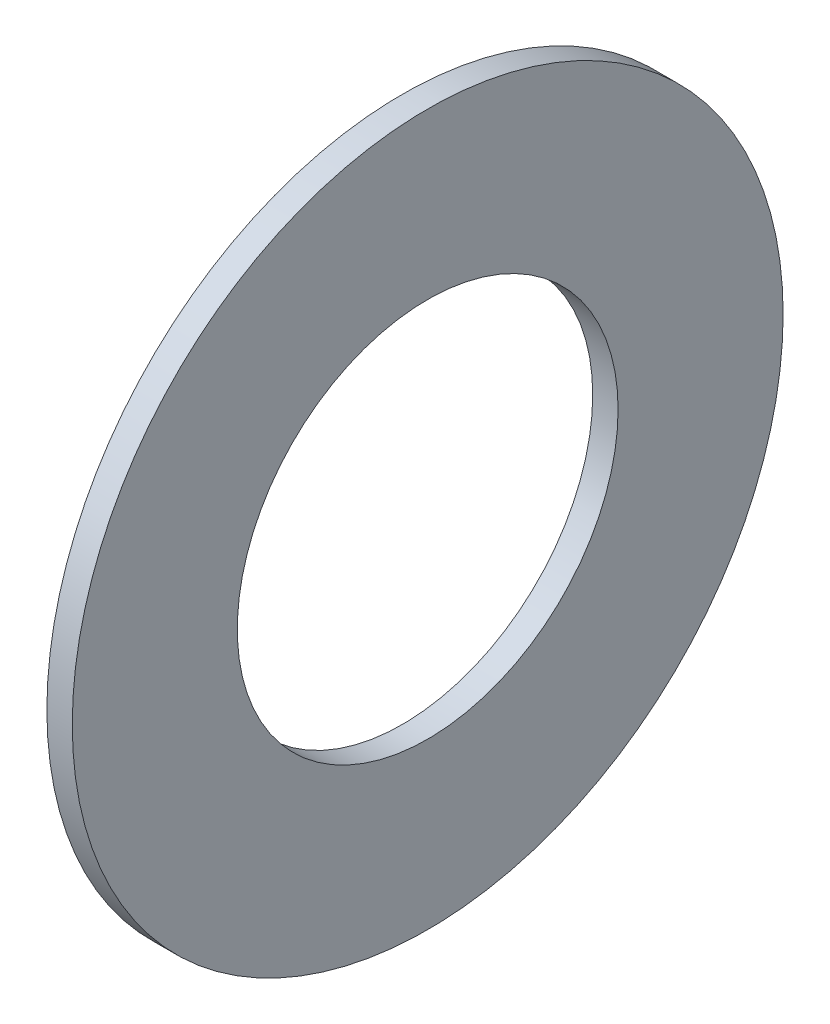
ISO-10303-21;
HEADER;
FILE_DESCRIPTION(('STEP AP214'),'2;1');
FILE_NAME('part.step','',(''),(''),'','','');
FILE_SCHEMA(('AUTOMOTIVE_DESIGN { 1 0 10303 214 1 1 1 1 }'));
ENDSEC;
DATA;
#1=APPLICATION_CONTEXT('core data for automotive mechanical design processes');
#2=APPLICATION_PROTOCOL_DEFINITION('international standard','automotive_design',2000,#1);
#3=PRODUCT_CONTEXT('',#1,'mechanical');
#4=PRODUCT('Part','Part','',(#3));
#5=PRODUCT_RELATED_PRODUCT_CATEGORY('part','',(#4));
#6=PRODUCT_DEFINITION_FORMATION('','',#4);
#7=PRODUCT_DEFINITION_CONTEXT('part definition',#1,'design');
#8=PRODUCT_DEFINITION('design','',#6,#7);
#9=PRODUCT_DEFINITION_SHAPE('','',#8);
#10=(LENGTH_UNIT() NAMED_UNIT(*) SI_UNIT(.MILLI.,.METRE.));
#11=(NAMED_UNIT(*) PLANE_ANGLE_UNIT() SI_UNIT($,.RADIAN.));
#12=(NAMED_UNIT(*) SI_UNIT($,.STERADIAN.) SOLID_ANGLE_UNIT());
#13=UNCERTAINTY_MEASURE_WITH_UNIT(LENGTH_MEASURE(1.E-05),#10,'distance_accuracy_value','');
#14=(GEOMETRIC_REPRESENTATION_CONTEXT(3) GLOBAL_UNCERTAINTY_ASSIGNED_CONTEXT((#13)) GLOBAL_UNIT_ASSIGNED_CONTEXT((#10,
#11,#12)) REPRESENTATION_CONTEXT('',''));
#15=CARTESIAN_POINT('',(0.,0.,0.));
#16=DIRECTION('',(0.,0.,1.));
#17=DIRECTION('',(1.,0.,0.));
#18=AXIS2_PLACEMENT_3D('',#15,#16,#17);
#19=CARTESIAN_POINT('',(1.,0.,0.));
#20=DIRECTION('',(1.,0.,0.));
#21=DIRECTION('',(0.,0.,-1.));
#22=AXIS2_PLACEMENT_3D('',#19,#20,#21);
#23=PLANE('',#22);
#24=CARTESIAN_POINT('',(1.,0.,0.));
#25=DIRECTION('',(1.,0.,0.));
#26=DIRECTION('',(0.,0.,-1.));
#27=AXIS2_PLACEMENT_3D('',#24,#25,#26);
#28=CIRCLE('',#27,14.);
#29=CARTESIAN_POINT('',(1.,0.,-14.));
#30=VERTEX_POINT('',#29);
#31=EDGE_CURVE('E10',#30,#30,#28,.T.);
#32=ORIENTED_EDGE('',*,*,#31,.T.);
#33=EDGE_LOOP('',(#32));
#34=FACE_BOUND('',#33,.T.);
#35=CARTESIAN_POINT('',(1.,0.,0.));
#36=DIRECTION('',(1.,0.,0.));
#37=DIRECTION('',(0.,0.,-1.));
#38=AXIS2_PLACEMENT_3D('',#35,#36,#37);
#39=CIRCLE('',#38,7.5);
#40=CARTESIAN_POINT('',(1.,0.,-7.5));
#41=VERTEX_POINT('',#40);
#42=EDGE_CURVE('E47',#41,#41,#39,.T.);
#43=ORIENTED_EDGE('',*,*,#42,.F.);
#44=EDGE_LOOP('',(#43));
#45=FACE_BOUND('',#44,.T.);
#46=ADVANCED_FACE('F36',(#34,#45),#23,.T.);
#47=CARTESIAN_POINT('',(0.,0.,0.));
#48=DIRECTION('',(1.,0.,0.));
#49=DIRECTION('',(0.,0.,-1.));
#50=AXIS2_PLACEMENT_3D('',#47,#48,#49);
#51=PLANE('',#50);
#52=CARTESIAN_POINT('',(0.,0.,0.));
#53=DIRECTION('',(1.,0.,0.));
#54=DIRECTION('',(0.,0.,-1.));
#55=AXIS2_PLACEMENT_3D('',#52,#53,#54);
#56=CIRCLE('',#55,14.);
#57=CARTESIAN_POINT('',(0.,0.,-14.));
#58=VERTEX_POINT('',#57);
#59=EDGE_CURVE('E40',#58,#58,#56,.T.);
#60=ORIENTED_EDGE('',*,*,#59,.F.);
#61=EDGE_LOOP('',(#60));
#62=FACE_BOUND('',#61,.T.);
#63=CARTESIAN_POINT('',(0.,0.,0.));
#64=DIRECTION('',(1.,0.,0.));
#65=DIRECTION('',(0.,0.,-1.));
#66=AXIS2_PLACEMENT_3D('',#63,#64,#65);
#67=CIRCLE('',#66,7.5);
#68=CARTESIAN_POINT('',(0.,0.,-7.5));
#69=VERTEX_POINT('',#68);
#70=EDGE_CURVE('E49',#69,#69,#67,.T.);
#71=ORIENTED_EDGE('',*,*,#70,.T.);
#72=EDGE_LOOP('',(#71));
#73=FACE_BOUND('',#72,.T.);
#74=ADVANCED_FACE('F59',(#62,#73),#51,.F.);
#75=CARTESIAN_POINT('',(1.,0.,0.));
#76=DIRECTION('',(-1.,0.,0.));
#77=DIRECTION('',(0.,0.,1.));
#78=AXIS2_PLACEMENT_3D('',#75,#76,#77);
#79=CYLINDRICAL_SURFACE('',#78,14.);
#80=ORIENTED_EDGE('',*,*,#31,.F.);
#81=EDGE_LOOP('',(#80));
#82=FACE_BOUND('',#81,.T.);
#83=ORIENTED_EDGE('',*,*,#59,.T.);
#84=EDGE_LOOP('',(#83));
#85=FACE_BOUND('',#84,.T.);
#86=ADVANCED_FACE('F38',(#82,#85),#79,.T.);
#87=CARTESIAN_POINT('',(1.,0.,0.));
#88=DIRECTION('',(-1.,0.,0.));
#89=DIRECTION('',(0.,0.,1.));
#90=AXIS2_PLACEMENT_3D('',#87,#88,#89);
#91=CYLINDRICAL_SURFACE('',#90,7.5);
#92=ORIENTED_EDGE('',*,*,#42,.T.);
#93=EDGE_LOOP('',(#92));
#94=FACE_BOUND('',#93,.T.);
#95=ORIENTED_EDGE('',*,*,#70,.F.);
#96=EDGE_LOOP('',(#95));
#97=FACE_BOUND('',#96,.T.);
#98=ADVANCED_FACE('F55',(#94,#97),#91,.F.);
#99=CLOSED_SHELL('',(#46,#74,#86,#98));
#100=MANIFOLD_SOLID_BREP('B2',#99);
#101=ADVANCED_BREP_SHAPE_REPRESENTATION('',(#18,#100),#14);
#102=SHAPE_DEFINITION_REPRESENTATION(#9,#101);
ENDSEC;
END-ISO-10303-21;
